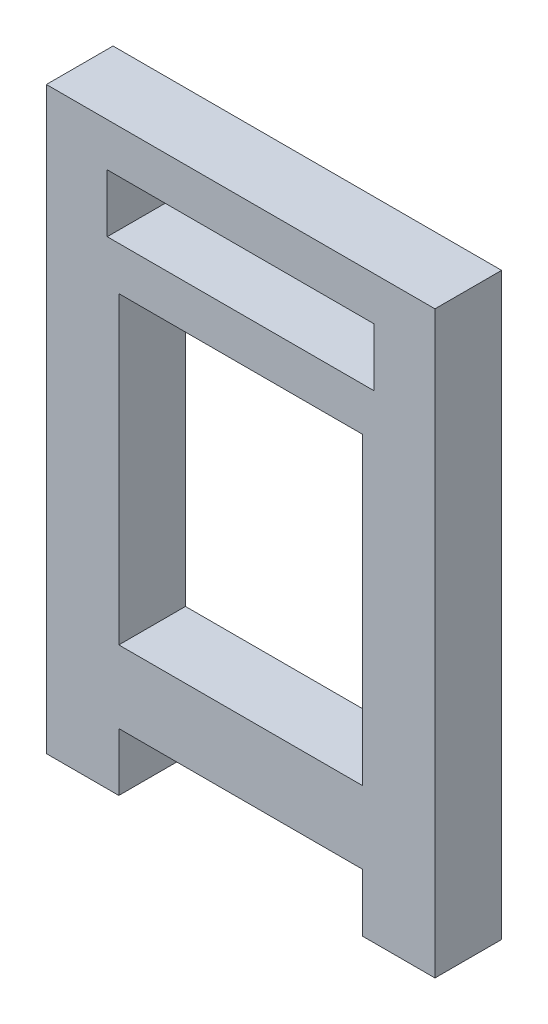
ISO-10303-21;
HEADER;
FILE_DESCRIPTION(('STEP AP214'),'2;1');
FILE_NAME('part.step','',(''),(''),'','','');
FILE_SCHEMA(('AUTOMOTIVE_DESIGN { 1 0 10303 214 1 1 1 1 }'));
ENDSEC;
DATA;
#1=APPLICATION_CONTEXT('core data for automotive mechanical design processes');
#2=APPLICATION_PROTOCOL_DEFINITION('international standard','automotive_design',2000,#1);
#3=PRODUCT_CONTEXT('',#1,'mechanical');
#4=PRODUCT('Part','Part','',(#3));
#5=PRODUCT_RELATED_PRODUCT_CATEGORY('part','',(#4));
#6=PRODUCT_DEFINITION_FORMATION('','',#4);
#7=PRODUCT_DEFINITION_CONTEXT('part definition',#1,'design');
#8=PRODUCT_DEFINITION('design','',#6,#7);
#9=PRODUCT_DEFINITION_SHAPE('','',#8);
#10=(LENGTH_UNIT() NAMED_UNIT(*) SI_UNIT(.MILLI.,.METRE.));
#11=(NAMED_UNIT(*) PLANE_ANGLE_UNIT() SI_UNIT($,.RADIAN.));
#12=(NAMED_UNIT(*) SI_UNIT($,.STERADIAN.) SOLID_ANGLE_UNIT());
#13=UNCERTAINTY_MEASURE_WITH_UNIT(LENGTH_MEASURE(1.E-05),#10,'distance_accuracy_value','');
#14=(GEOMETRIC_REPRESENTATION_CONTEXT(3) GLOBAL_UNCERTAINTY_ASSIGNED_CONTEXT((#13)) GLOBAL_UNIT_ASSIGNED_CONTEXT((#10,
#11,#12)) REPRESENTATION_CONTEXT('',''));
#15=CARTESIAN_POINT('',(0.,0.,0.));
#16=DIRECTION('',(0.,0.,1.));
#17=DIRECTION('',(1.,0.,0.));
#18=AXIS2_PLACEMENT_3D('',#15,#16,#17);
#19=CARTESIAN_POINT('',(0.,0.,2.3));
#20=DIRECTION('',(0.,0.,-1.));
#21=DIRECTION('',(-1.,0.,0.));
#22=AXIS2_PLACEMENT_3D('',#19,#20,#21);
#23=PLANE('',#22);
#24=DIRECTION('',(0.,1.,0.));
#25=VECTOR('',#24,1.);
#26=CARTESIAN_POINT('',(10.91,2.5,2.3));
#27=LINE('',#26,#25);
#28=CARTESIAN_POINT('',(10.91,2.5,2.3));
#29=VERTEX_POINT('',#28);
#30=CARTESIAN_POINT('',(10.91,13.,2.3));
#31=VERTEX_POINT('',#30);
#32=EDGE_CURVE('E188',#29,#31,#27,.T.);
#33=ORIENTED_EDGE('',*,*,#32,.F.);
#34=DIRECTION('',(1.,0.,0.));
#35=VECTOR('',#34,1.);
#36=CARTESIAN_POINT('',(2.5,2.5,2.3));
#37=LINE('',#36,#35);
#38=CARTESIAN_POINT('',(2.5,2.5,2.3));
#39=VERTEX_POINT('',#38);
#40=EDGE_CURVE('E196',#39,#29,#37,.T.);
#41=ORIENTED_EDGE('',*,*,#40,.F.);
#42=DIRECTION('',(0.,-1.,0.));
#43=VECTOR('',#42,1.);
#44=CARTESIAN_POINT('',(2.5,2.5,2.3));
#45=LINE('',#44,#43);
#46=CARTESIAN_POINT('',(2.5,13.,2.3));
#47=VERTEX_POINT('',#46);
#48=EDGE_CURVE('E193',#47,#39,#45,.T.);
#49=ORIENTED_EDGE('',*,*,#48,.F.);
#50=DIRECTION('',(-1.,0.,0.));
#51=VECTOR('',#50,1.);
#52=CARTESIAN_POINT('',(2.5,13.,2.3));
#53=LINE('',#52,#51);
#54=EDGE_CURVE('E190',#31,#47,#53,.T.);
#55=ORIENTED_EDGE('',*,*,#54,.F.);
#56=EDGE_LOOP('',(#33,#41,#49,#55));
#57=FACE_BOUND('',#56,.T.);
#58=DIRECTION('',(0.,-1.,0.));
#59=VECTOR('',#58,1.);
#60=CARTESIAN_POINT('',(0.,0.,2.3));
#61=LINE('',#60,#59);
#62=CARTESIAN_POINT('',(0.,18.,2.3));
#63=VERTEX_POINT('',#62);
#64=CARTESIAN_POINT('',(0.,-2.,2.3));
#65=VERTEX_POINT('',#64);
#66=EDGE_CURVE('E219',#63,#65,#61,.T.);
#67=ORIENTED_EDGE('',*,*,#66,.T.);
#68=DIRECTION('',(1.,0.,0.));
#69=VECTOR('',#68,1.);
#70=CARTESIAN_POINT('',(0.,-2.,2.3));
#71=LINE('',#70,#69);
#72=CARTESIAN_POINT('',(2.5,-2.,2.3));
#73=VERTEX_POINT('',#72);
#74=EDGE_CURVE('E221',#65,#73,#71,.T.);
#75=ORIENTED_EDGE('',*,*,#74,.T.);
#76=DIRECTION('',(0.,1.,0.));
#77=VECTOR('',#76,1.);
#78=CARTESIAN_POINT('',(2.5,-2.,2.3));
#79=LINE('',#78,#77);
#80=CARTESIAN_POINT('',(2.5,0.,2.3));
#81=VERTEX_POINT('',#80);
#82=EDGE_CURVE('E224',#73,#81,#79,.T.);
#83=ORIENTED_EDGE('',*,*,#82,.T.);
#84=DIRECTION('',(1.,0.,0.));
#85=VECTOR('',#84,1.);
#86=CARTESIAN_POINT('',(2.5,0.,2.3));
#87=LINE('',#86,#85);
#88=CARTESIAN_POINT('',(10.91,0.,2.3));
#89=VERTEX_POINT('',#88);
#90=EDGE_CURVE('E226',#81,#89,#87,.T.);
#91=ORIENTED_EDGE('',*,*,#90,.T.);
#92=DIRECTION('',(0.,-1.,0.));
#93=VECTOR('',#92,1.);
#94=CARTESIAN_POINT('',(10.91,-2.,2.3));
#95=LINE('',#94,#93);
#96=CARTESIAN_POINT('',(10.91,-2.,2.3));
#97=VERTEX_POINT('',#96);
#98=EDGE_CURVE('E228',#89,#97,#95,.T.);
#99=ORIENTED_EDGE('',*,*,#98,.T.);
#100=DIRECTION('',(1.,0.,0.));
#101=VECTOR('',#100,1.);
#102=CARTESIAN_POINT('',(13.41,-2.,2.3));
#103=LINE('',#102,#101);
#104=CARTESIAN_POINT('',(13.41,-2.,2.3));
#105=VERTEX_POINT('',#104);
#106=EDGE_CURVE('E230',#97,#105,#103,.T.);
#107=ORIENTED_EDGE('',*,*,#106,.T.);
#108=DIRECTION('',(0.,1.,0.));
#109=VECTOR('',#108,1.);
#110=CARTESIAN_POINT('',(13.41,0.,2.3));
#111=LINE('',#110,#109);
#112=CARTESIAN_POINT('',(13.41,18.,2.3));
#113=VERTEX_POINT('',#112);
#114=EDGE_CURVE('E232',#105,#113,#111,.T.);
#115=ORIENTED_EDGE('',*,*,#114,.T.);
#116=DIRECTION('',(-1.,0.,0.));
#117=VECTOR('',#116,1.);
#118=CARTESIAN_POINT('',(0.,18.,2.3));
#119=LINE('',#118,#117);
#120=EDGE_CURVE('E234',#113,#63,#119,.T.);
#121=ORIENTED_EDGE('',*,*,#120,.T.);
#122=EDGE_LOOP('',(#67,#75,#83,#91,#99,#107,#115,#121));
#123=FACE_BOUND('',#122,.T.);
#124=DIRECTION('',(0.,-1.,0.));
#125=VECTOR('',#124,1.);
#126=CARTESIAN_POINT('',(2.1,14.5,2.3));
#127=LINE('',#126,#125);
#128=CARTESIAN_POINT('',(2.1,16.5,2.3));
#129=VERTEX_POINT('',#128);
#130=CARTESIAN_POINT('',(2.1,14.5,2.3));
#131=VERTEX_POINT('',#130);
#132=EDGE_CURVE('E152',#129,#131,#127,.T.);
#133=ORIENTED_EDGE('',*,*,#132,.F.);
#134=DIRECTION('',(-1.,0.,0.));
#135=VECTOR('',#134,1.);
#136=CARTESIAN_POINT('',(2.1,16.5,2.3));
#137=LINE('',#136,#135);
#138=CARTESIAN_POINT('',(11.31,16.5,2.3));
#139=VERTEX_POINT('',#138);
#140=EDGE_CURVE('E174',#139,#129,#137,.T.);
#141=ORIENTED_EDGE('',*,*,#140,.F.);
#142=DIRECTION('',(0.,1.,0.));
#143=VECTOR('',#142,1.);
#144=CARTESIAN_POINT('',(11.31,14.5,2.3));
#145=LINE('',#144,#143);
#146=CARTESIAN_POINT('',(11.31,14.5,2.3));
#147=VERTEX_POINT('',#146);
#148=EDGE_CURVE('E172',#147,#139,#145,.T.);
#149=ORIENTED_EDGE('',*,*,#148,.F.);
#150=DIRECTION('',(1.,0.,0.));
#151=VECTOR('',#150,1.);
#152=CARTESIAN_POINT('',(2.1,14.5,2.3));
#153=LINE('',#152,#151);
#154=EDGE_CURVE('E160',#131,#147,#153,.T.);
#155=ORIENTED_EDGE('',*,*,#154,.F.);
#156=EDGE_LOOP('',(#133,#141,#149,#155));
#157=FACE_BOUND('',#156,.T.);
#158=ADVANCED_FACE('F39',(#57,#123,#157),#23,.F.);
#159=CARTESIAN_POINT('',(0.,0.,0.));
#160=DIRECTION('',(0.,0.,-1.));
#161=DIRECTION('',(-1.,0.,0.));
#162=AXIS2_PLACEMENT_3D('',#159,#160,#161);
#163=PLANE('',#162);
#164=DIRECTION('',(0.,-1.,0.));
#165=VECTOR('',#164,1.);
#166=CARTESIAN_POINT('',(0.,0.,0.));
#167=LINE('',#166,#165);
#168=CARTESIAN_POINT('',(0.,18.,0.));
#169=VERTEX_POINT('',#168);
#170=CARTESIAN_POINT('',(0.,-2.,0.));
#171=VERTEX_POINT('',#170);
#172=EDGE_CURVE('E218',#169,#171,#167,.T.);
#173=ORIENTED_EDGE('',*,*,#172,.F.);
#174=DIRECTION('',(-1.,0.,0.));
#175=VECTOR('',#174,1.);
#176=CARTESIAN_POINT('',(0.,18.,0.));
#177=LINE('',#176,#175);
#178=CARTESIAN_POINT('',(13.41,18.,0.));
#179=VERTEX_POINT('',#178);
#180=EDGE_CURVE('E222',#179,#169,#177,.T.);
#181=ORIENTED_EDGE('',*,*,#180,.F.);
#182=DIRECTION('',(0.,1.,0.));
#183=VECTOR('',#182,1.);
#184=CARTESIAN_POINT('',(13.41,0.,0.));
#185=LINE('',#184,#183);
#186=CARTESIAN_POINT('',(13.41,-2.,0.));
#187=VERTEX_POINT('',#186);
#188=EDGE_CURVE('E249',#187,#179,#185,.T.);
#189=ORIENTED_EDGE('',*,*,#188,.F.);
#190=DIRECTION('',(1.,0.,0.));
#191=VECTOR('',#190,1.);
#192=CARTESIAN_POINT('',(13.41,-2.,0.));
#193=LINE('',#192,#191);
#194=CARTESIAN_POINT('',(10.91,-2.,0.));
#195=VERTEX_POINT('',#194);
#196=EDGE_CURVE('E246',#195,#187,#193,.T.);
#197=ORIENTED_EDGE('',*,*,#196,.F.);
#198=DIRECTION('',(0.,-1.,0.));
#199=VECTOR('',#198,1.);
#200=CARTESIAN_POINT('',(10.91,-2.,0.));
#201=LINE('',#200,#199);
#202=CARTESIAN_POINT('',(10.91,0.,0.));
#203=VERTEX_POINT('',#202);
#204=EDGE_CURVE('E244',#203,#195,#201,.T.);
#205=ORIENTED_EDGE('',*,*,#204,.F.);
#206=DIRECTION('',(1.,0.,0.));
#207=VECTOR('',#206,1.);
#208=CARTESIAN_POINT('',(2.5,0.,0.));
#209=LINE('',#208,#207);
#210=CARTESIAN_POINT('',(2.5,0.,0.));
#211=VERTEX_POINT('',#210);
#212=EDGE_CURVE('E242',#211,#203,#209,.T.);
#213=ORIENTED_EDGE('',*,*,#212,.F.);
#214=DIRECTION('',(0.,1.,0.));
#215=VECTOR('',#214,1.);
#216=CARTESIAN_POINT('',(2.5,-2.,0.));
#217=LINE('',#216,#215);
#218=CARTESIAN_POINT('',(2.5,-2.,0.));
#219=VERTEX_POINT('',#218);
#220=EDGE_CURVE('E240',#219,#211,#217,.T.);
#221=ORIENTED_EDGE('',*,*,#220,.F.);
#222=DIRECTION('',(1.,0.,0.));
#223=VECTOR('',#222,1.);
#224=CARTESIAN_POINT('',(0.,-2.,0.));
#225=LINE('',#224,#223);
#226=EDGE_CURVE('E238',#171,#219,#225,.T.);
#227=ORIENTED_EDGE('',*,*,#226,.F.);
#228=EDGE_LOOP('',(#173,#181,#189,#197,#205,#213,#221,#227));
#229=FACE_BOUND('',#228,.T.);
#230=DIRECTION('',(1.,0.,0.));
#231=VECTOR('',#230,1.);
#232=CARTESIAN_POINT('',(2.5,2.5,0.));
#233=LINE('',#232,#231);
#234=CARTESIAN_POINT('',(2.5,2.5,0.));
#235=VERTEX_POINT('',#234);
#236=CARTESIAN_POINT('',(10.91,2.5,0.));
#237=VERTEX_POINT('',#236);
#238=EDGE_CURVE('E191',#235,#237,#233,.T.);
#239=ORIENTED_EDGE('',*,*,#238,.T.);
#240=DIRECTION('',(0.,1.,0.));
#241=VECTOR('',#240,1.);
#242=CARTESIAN_POINT('',(10.91,2.5,0.));
#243=LINE('',#242,#241);
#244=CARTESIAN_POINT('',(10.91,13.,0.));
#245=VERTEX_POINT('',#244);
#246=EDGE_CURVE('E168',#237,#245,#243,.T.);
#247=ORIENTED_EDGE('',*,*,#246,.T.);
#248=DIRECTION('',(-1.,0.,0.));
#249=VECTOR('',#248,1.);
#250=CARTESIAN_POINT('',(2.5,13.,0.));
#251=LINE('',#250,#249);
#252=CARTESIAN_POINT('',(2.5,13.,0.));
#253=VERTEX_POINT('',#252);
#254=EDGE_CURVE('E201',#245,#253,#251,.T.);
#255=ORIENTED_EDGE('',*,*,#254,.T.);
#256=DIRECTION('',(0.,-1.,0.));
#257=VECTOR('',#256,1.);
#258=CARTESIAN_POINT('',(2.5,2.5,0.));
#259=LINE('',#258,#257);
#260=EDGE_CURVE('E204',#253,#235,#259,.T.);
#261=ORIENTED_EDGE('',*,*,#260,.T.);
#262=EDGE_LOOP('',(#239,#247,#255,#261));
#263=FACE_BOUND('',#262,.T.);
#264=DIRECTION('',(-1.,0.,0.));
#265=VECTOR('',#264,1.);
#266=CARTESIAN_POINT('',(2.1,16.5,0.));
#267=LINE('',#266,#265);
#268=CARTESIAN_POINT('',(11.31,16.5,0.));
#269=VERTEX_POINT('',#268);
#270=CARTESIAN_POINT('',(2.1,16.5,0.));
#271=VERTEX_POINT('',#270);
#272=EDGE_CURVE('E161',#269,#271,#267,.T.);
#273=ORIENTED_EDGE('',*,*,#272,.T.);
#274=DIRECTION('',(0.,-1.,0.));
#275=VECTOR('',#274,1.);
#276=CARTESIAN_POINT('',(2.1,14.5,0.));
#277=LINE('',#276,#275);
#278=CARTESIAN_POINT('',(2.1,14.5,0.));
#279=VERTEX_POINT('',#278);
#280=EDGE_CURVE('E62',#271,#279,#277,.T.);
#281=ORIENTED_EDGE('',*,*,#280,.T.);
#282=DIRECTION('',(1.,0.,0.));
#283=VECTOR('',#282,1.);
#284=CARTESIAN_POINT('',(2.1,14.5,0.));
#285=LINE('',#284,#283);
#286=CARTESIAN_POINT('',(11.31,14.5,0.));
#287=VERTEX_POINT('',#286);
#288=EDGE_CURVE('E167',#279,#287,#285,.T.);
#289=ORIENTED_EDGE('',*,*,#288,.T.);
#290=DIRECTION('',(0.,1.,0.));
#291=VECTOR('',#290,1.);
#292=CARTESIAN_POINT('',(11.31,14.5,0.));
#293=LINE('',#292,#291);
#294=EDGE_CURVE('E180',#287,#269,#293,.T.);
#295=ORIENTED_EDGE('',*,*,#294,.T.);
#296=EDGE_LOOP('',(#273,#281,#289,#295));
#297=FACE_BOUND('',#296,.T.);
#298=ADVANCED_FACE('F281',(#229,#263,#297),#163,.T.);
#299=CARTESIAN_POINT('',(0.,0.,2.3));
#300=DIRECTION('',(1.,0.,0.));
#301=DIRECTION('',(0.,1.,0.));
#302=AXIS2_PLACEMENT_3D('',#299,#300,#301);
#303=PLANE('',#302);
#304=ORIENTED_EDGE('',*,*,#172,.T.);
#305=DIRECTION('',(0.,0.,-1.));
#306=VECTOR('',#305,1.);
#307=CARTESIAN_POINT('',(0.,-2.,2.3));
#308=LINE('',#307,#306);
#309=EDGE_CURVE('E11',#65,#171,#308,.T.);
#310=ORIENTED_EDGE('',*,*,#309,.F.);
#311=ORIENTED_EDGE('',*,*,#66,.F.);
#312=DIRECTION('',(0.,0.,-1.));
#313=VECTOR('',#312,1.);
#314=CARTESIAN_POINT('',(0.,18.,2.3));
#315=LINE('',#314,#313);
#316=EDGE_CURVE('E236',#63,#169,#315,.T.);
#317=ORIENTED_EDGE('',*,*,#316,.T.);
#318=EDGE_LOOP('',(#304,#310,#311,#317));
#319=FACE_BOUND('',#318,.T.);
#320=ADVANCED_FACE('F41',(#319),#303,.F.);
#321=CARTESIAN_POINT('',(0.,-2.,2.3));
#322=DIRECTION('',(0.,1.,0.));
#323=DIRECTION('',(0.,0.,1.));
#324=AXIS2_PLACEMENT_3D('',#321,#322,#323);
#325=PLANE('',#324);
#326=ORIENTED_EDGE('',*,*,#226,.T.);
#327=DIRECTION('',(0.,0.,-1.));
#328=VECTOR('',#327,1.);
#329=CARTESIAN_POINT('',(2.5,-2.,2.3));
#330=LINE('',#329,#328);
#331=EDGE_CURVE('E47',#73,#219,#330,.T.);
#332=ORIENTED_EDGE('',*,*,#331,.F.);
#333=ORIENTED_EDGE('',*,*,#74,.F.);
#334=ORIENTED_EDGE('',*,*,#309,.T.);
#335=EDGE_LOOP('',(#326,#332,#333,#334));
#336=FACE_BOUND('',#335,.T.);
#337=ADVANCED_FACE('F298',(#336),#325,.F.);
#338=CARTESIAN_POINT('',(2.5,-2.,2.3));
#339=DIRECTION('',(-1.,0.,0.));
#340=DIRECTION('',(0.,0.,1.));
#341=AXIS2_PLACEMENT_3D('',#338,#339,#340);
#342=PLANE('',#341);
#343=ORIENTED_EDGE('',*,*,#220,.T.);
#344=DIRECTION('',(0.,0.,-1.));
#345=VECTOR('',#344,1.);
#346=CARTESIAN_POINT('',(2.5,0.,2.3));
#347=LINE('',#346,#345);
#348=EDGE_CURVE('E267',#81,#211,#347,.T.);
#349=ORIENTED_EDGE('',*,*,#348,.F.);
#350=ORIENTED_EDGE('',*,*,#82,.F.);
#351=ORIENTED_EDGE('',*,*,#331,.T.);
#352=EDGE_LOOP('',(#343,#349,#350,#351));
#353=FACE_BOUND('',#352,.T.);
#354=ADVANCED_FACE('F274',(#353),#342,.F.);
#355=CARTESIAN_POINT('',(2.5,0.,2.3));
#356=DIRECTION('',(0.,1.,0.));
#357=DIRECTION('',(0.,0.,1.));
#358=AXIS2_PLACEMENT_3D('',#355,#356,#357);
#359=PLANE('',#358);
#360=ORIENTED_EDGE('',*,*,#212,.T.);
#361=DIRECTION('',(0.,0.,-1.));
#362=VECTOR('',#361,1.);
#363=CARTESIAN_POINT('',(10.91,0.,2.3));
#364=LINE('',#363,#362);
#365=EDGE_CURVE('E264',#89,#203,#364,.T.);
#366=ORIENTED_EDGE('',*,*,#365,.F.);
#367=ORIENTED_EDGE('',*,*,#90,.F.);
#368=ORIENTED_EDGE('',*,*,#348,.T.);
#369=EDGE_LOOP('',(#360,#366,#367,#368));
#370=FACE_BOUND('',#369,.T.);
#371=ADVANCED_FACE('F287',(#370),#359,.F.);
#372=CARTESIAN_POINT('',(10.91,-2.,2.3));
#373=DIRECTION('',(1.,0.,0.));
#374=DIRECTION('',(0.,0.,-1.));
#375=AXIS2_PLACEMENT_3D('',#372,#373,#374);
#376=PLANE('',#375);
#377=ORIENTED_EDGE('',*,*,#204,.T.);
#378=DIRECTION('',(0.,0.,-1.));
#379=VECTOR('',#378,1.);
#380=CARTESIAN_POINT('',(10.91,-2.,2.3));
#381=LINE('',#380,#379);
#382=EDGE_CURVE('E261',#97,#195,#381,.T.);
#383=ORIENTED_EDGE('',*,*,#382,.F.);
#384=ORIENTED_EDGE('',*,*,#98,.F.);
#385=ORIENTED_EDGE('',*,*,#365,.T.);
#386=EDGE_LOOP('',(#377,#383,#384,#385));
#387=FACE_BOUND('',#386,.T.);
#388=ADVANCED_FACE('F291',(#387),#376,.F.);
#389=CARTESIAN_POINT('',(13.41,-2.,2.3));
#390=DIRECTION('',(0.,1.,0.));
#391=DIRECTION('',(-1.,0.,0.));
#392=AXIS2_PLACEMENT_3D('',#389,#390,#391);
#393=PLANE('',#392);
#394=ORIENTED_EDGE('',*,*,#196,.T.);
#395=DIRECTION('',(0.,0.,-1.));
#396=VECTOR('',#395,1.);
#397=CARTESIAN_POINT('',(13.41,-2.,2.3));
#398=LINE('',#397,#396);
#399=EDGE_CURVE('E258',#105,#187,#398,.T.);
#400=ORIENTED_EDGE('',*,*,#399,.F.);
#401=ORIENTED_EDGE('',*,*,#106,.F.);
#402=ORIENTED_EDGE('',*,*,#382,.T.);
#403=EDGE_LOOP('',(#394,#400,#401,#402));
#404=FACE_BOUND('',#403,.T.);
#405=ADVANCED_FACE('F310',(#404),#393,.F.);
#406=CARTESIAN_POINT('',(13.41,0.,2.3));
#407=DIRECTION('',(-1.,0.,0.));
#408=DIRECTION('',(0.,0.,1.));
#409=AXIS2_PLACEMENT_3D('',#406,#407,#408);
#410=PLANE('',#409);
#411=ORIENTED_EDGE('',*,*,#188,.T.);
#412=DIRECTION('',(0.,0.,-1.));
#413=VECTOR('',#412,1.);
#414=CARTESIAN_POINT('',(13.41,18.,2.3));
#415=LINE('',#414,#413);
#416=EDGE_CURVE('E255',#113,#179,#415,.T.);
#417=ORIENTED_EDGE('',*,*,#416,.F.);
#418=ORIENTED_EDGE('',*,*,#114,.F.);
#419=ORIENTED_EDGE('',*,*,#399,.T.);
#420=EDGE_LOOP('',(#411,#417,#418,#419));
#421=FACE_BOUND('',#420,.T.);
#422=ADVANCED_FACE('F308',(#421),#410,.F.);
#423=CARTESIAN_POINT('',(0.,18.,2.3));
#424=DIRECTION('',(0.,-1.,0.));
#425=DIRECTION('',(0.,0.,-1.));
#426=AXIS2_PLACEMENT_3D('',#423,#424,#425);
#427=PLANE('',#426);
#428=ORIENTED_EDGE('',*,*,#180,.T.);
#429=ORIENTED_EDGE('',*,*,#316,.F.);
#430=ORIENTED_EDGE('',*,*,#120,.F.);
#431=ORIENTED_EDGE('',*,*,#416,.T.);
#432=EDGE_LOOP('',(#428,#429,#430,#431));
#433=FACE_BOUND('',#432,.T.);
#434=ADVANCED_FACE('F303',(#433),#427,.F.);
#435=CARTESIAN_POINT('',(10.91,2.5,2.3));
#436=DIRECTION('',(-1.,0.,0.));
#437=DIRECTION('',(0.,0.,1.));
#438=AXIS2_PLACEMENT_3D('',#435,#436,#437);
#439=PLANE('',#438);
#440=ORIENTED_EDGE('',*,*,#246,.F.);
#441=DIRECTION('',(0.,0.,-1.));
#442=VECTOR('',#441,1.);
#443=CARTESIAN_POINT('',(10.91,2.5,2.3));
#444=LINE('',#443,#442);
#445=EDGE_CURVE('E198',#29,#237,#444,.T.);
#446=ORIENTED_EDGE('',*,*,#445,.F.);
#447=ORIENTED_EDGE('',*,*,#32,.T.);
#448=DIRECTION('',(0.,0.,-1.));
#449=VECTOR('',#448,1.);
#450=CARTESIAN_POINT('',(10.91,13.,2.3));
#451=LINE('',#450,#449);
#452=EDGE_CURVE('E215',#31,#245,#451,.T.);
#453=ORIENTED_EDGE('',*,*,#452,.T.);
#454=EDGE_LOOP('',(#440,#446,#447,#453));
#455=FACE_BOUND('',#454,.T.);
#456=ADVANCED_FACE('F328',(#455),#439,.T.);
#457=CARTESIAN_POINT('',(2.5,13.,2.3));
#458=DIRECTION('',(0.,-1.,0.));
#459=DIRECTION('',(0.,0.,-1.));
#460=AXIS2_PLACEMENT_3D('',#457,#458,#459);
#461=PLANE('',#460);
#462=ORIENTED_EDGE('',*,*,#254,.F.);
#463=ORIENTED_EDGE('',*,*,#452,.F.);
#464=ORIENTED_EDGE('',*,*,#54,.T.);
#465=DIRECTION('',(0.,0.,-1.));
#466=VECTOR('',#465,1.);
#467=CARTESIAN_POINT('',(2.5,13.,2.3));
#468=LINE('',#467,#466);
#469=EDGE_CURVE('E213',#47,#253,#468,.T.);
#470=ORIENTED_EDGE('',*,*,#469,.T.);
#471=EDGE_LOOP('',(#462,#463,#464,#470));
#472=FACE_BOUND('',#471,.T.);
#473=ADVANCED_FACE('F335',(#472),#461,.T.);
#474=CARTESIAN_POINT('',(2.5,2.5,2.3));
#475=DIRECTION('',(1.,0.,0.));
#476=DIRECTION('',(0.,0.,-1.));
#477=AXIS2_PLACEMENT_3D('',#474,#475,#476);
#478=PLANE('',#477);
#479=ORIENTED_EDGE('',*,*,#260,.F.);
#480=ORIENTED_EDGE('',*,*,#469,.F.);
#481=ORIENTED_EDGE('',*,*,#48,.T.);
#482=DIRECTION('',(0.,0.,-1.));
#483=VECTOR('',#482,1.);
#484=CARTESIAN_POINT('',(2.5,2.5,2.3));
#485=LINE('',#484,#483);
#486=EDGE_CURVE('E211',#39,#235,#485,.T.);
#487=ORIENTED_EDGE('',*,*,#486,.T.);
#488=EDGE_LOOP('',(#479,#480,#481,#487));
#489=FACE_BOUND('',#488,.T.);
#490=ADVANCED_FACE('F340',(#489),#478,.T.);
#491=CARTESIAN_POINT('',(2.5,2.5,2.3));
#492=DIRECTION('',(0.,1.,0.));
#493=DIRECTION('',(0.,0.,1.));
#494=AXIS2_PLACEMENT_3D('',#491,#492,#493);
#495=PLANE('',#494);
#496=ORIENTED_EDGE('',*,*,#238,.F.);
#497=ORIENTED_EDGE('',*,*,#486,.F.);
#498=ORIENTED_EDGE('',*,*,#40,.T.);
#499=ORIENTED_EDGE('',*,*,#445,.T.);
#500=EDGE_LOOP('',(#496,#497,#498,#499));
#501=FACE_BOUND('',#500,.T.);
#502=ADVANCED_FACE('F346',(#501),#495,.T.);
#503=CARTESIAN_POINT('',(2.1,14.5,2.3));
#504=DIRECTION('',(1.,0.,0.));
#505=DIRECTION('',(0.,0.,-1.));
#506=AXIS2_PLACEMENT_3D('',#503,#504,#505);
#507=PLANE('',#506);
#508=ORIENTED_EDGE('',*,*,#280,.F.);
#509=DIRECTION('',(0.,0.,-1.));
#510=VECTOR('',#509,1.);
#511=CARTESIAN_POINT('',(2.1,16.5,2.3));
#512=LINE('',#511,#510);
#513=EDGE_CURVE('E156',#129,#271,#512,.T.);
#514=ORIENTED_EDGE('',*,*,#513,.F.);
#515=ORIENTED_EDGE('',*,*,#132,.T.);
#516=DIRECTION('',(0.,0.,-1.));
#517=VECTOR('',#516,1.);
#518=CARTESIAN_POINT('',(2.1,14.5,2.3));
#519=LINE('',#518,#517);
#520=EDGE_CURVE('E155',#131,#279,#519,.T.);
#521=ORIENTED_EDGE('',*,*,#520,.T.);
#522=EDGE_LOOP('',(#508,#514,#515,#521));
#523=FACE_BOUND('',#522,.T.);
#524=ADVANCED_FACE('F154',(#523),#507,.T.);
#525=CARTESIAN_POINT('',(2.1,14.5,2.3));
#526=DIRECTION('',(0.,1.,0.));
#527=DIRECTION('',(0.,0.,1.));
#528=AXIS2_PLACEMENT_3D('',#525,#526,#527);
#529=PLANE('',#528);
#530=ORIENTED_EDGE('',*,*,#288,.F.);
#531=ORIENTED_EDGE('',*,*,#520,.F.);
#532=ORIENTED_EDGE('',*,*,#154,.T.);
#533=DIRECTION('',(0.,0.,-1.));
#534=VECTOR('',#533,1.);
#535=CARTESIAN_POINT('',(11.31,14.5,2.3));
#536=LINE('',#535,#534);
#537=EDGE_CURVE('E169',#147,#287,#536,.T.);
#538=ORIENTED_EDGE('',*,*,#537,.T.);
#539=EDGE_LOOP('',(#530,#531,#532,#538));
#540=FACE_BOUND('',#539,.T.);
#541=ADVANCED_FACE('F164',(#540),#529,.T.);
#542=CARTESIAN_POINT('',(11.31,14.5,2.3));
#543=DIRECTION('',(-1.,0.,0.));
#544=DIRECTION('',(0.,0.,1.));
#545=AXIS2_PLACEMENT_3D('',#542,#543,#544);
#546=PLANE('',#545);
#547=ORIENTED_EDGE('',*,*,#294,.F.);
#548=ORIENTED_EDGE('',*,*,#537,.F.);
#549=ORIENTED_EDGE('',*,*,#148,.T.);
#550=DIRECTION('',(0.,0.,-1.));
#551=VECTOR('',#550,1.);
#552=CARTESIAN_POINT('',(11.31,16.5,2.3));
#553=LINE('',#552,#551);
#554=EDGE_CURVE('E54',#139,#269,#553,.T.);
#555=ORIENTED_EDGE('',*,*,#554,.T.);
#556=EDGE_LOOP('',(#547,#548,#549,#555));
#557=FACE_BOUND('',#556,.T.);
#558=ADVANCED_FACE('F365',(#557),#546,.T.);
#559=CARTESIAN_POINT('',(2.1,16.5,2.3));
#560=DIRECTION('',(0.,-1.,0.));
#561=DIRECTION('',(0.,0.,-1.));
#562=AXIS2_PLACEMENT_3D('',#559,#560,#561);
#563=PLANE('',#562);
#564=ORIENTED_EDGE('',*,*,#272,.F.);
#565=ORIENTED_EDGE('',*,*,#554,.F.);
#566=ORIENTED_EDGE('',*,*,#140,.T.);
#567=ORIENTED_EDGE('',*,*,#513,.T.);
#568=EDGE_LOOP('',(#564,#565,#566,#567));
#569=FACE_BOUND('',#568,.T.);
#570=ADVANCED_FACE('F368',(#569),#563,.T.);
#571=CLOSED_SHELL('',(#158,#298,#320,#337,#354,#371,#388,#405,#422,#434,#456,#473,#490,#502,
#524,#541,#558,#570));
#572=MANIFOLD_SOLID_BREP('B2',#571);
#573=ADVANCED_BREP_SHAPE_REPRESENTATION('',(#18,#572),#14);
#574=SHAPE_DEFINITION_REPRESENTATION(#9,#573);
ENDSEC;
END-ISO-10303-21;
